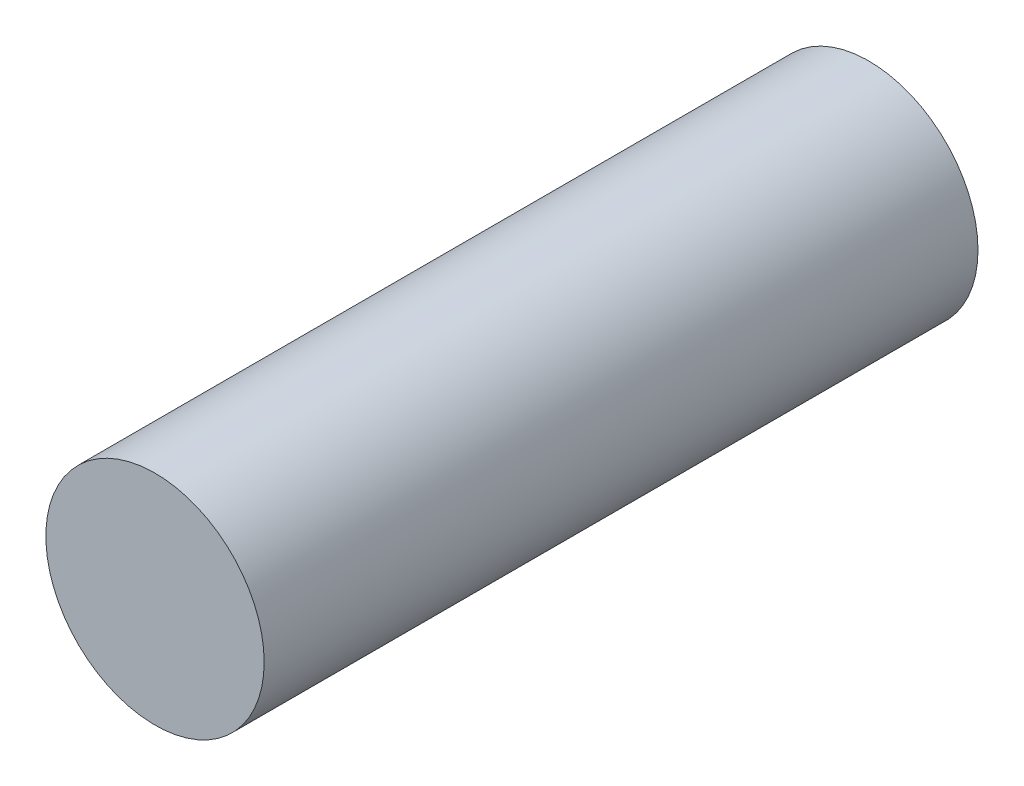
ISO-10303-21;
HEADER;
FILE_DESCRIPTION(('STEP AP214'),'2;1');
FILE_NAME('part.step','',(''),(''),'','','');
FILE_SCHEMA(('AUTOMOTIVE_DESIGN { 1 0 10303 214 1 1 1 1 }'));
ENDSEC;
DATA;
#1=APPLICATION_CONTEXT('core data for automotive mechanical design processes');
#2=APPLICATION_PROTOCOL_DEFINITION('international standard','automotive_design',2000,#1);
#3=PRODUCT_CONTEXT('',#1,'mechanical');
#4=PRODUCT('Part','Part','',(#3));
#5=PRODUCT_RELATED_PRODUCT_CATEGORY('part','',(#4));
#6=PRODUCT_DEFINITION_FORMATION('','',#4);
#7=PRODUCT_DEFINITION_CONTEXT('part definition',#1,'design');
#8=PRODUCT_DEFINITION('design','',#6,#7);
#9=PRODUCT_DEFINITION_SHAPE('','',#8);
#10=(LENGTH_UNIT() NAMED_UNIT(*) SI_UNIT(.MILLI.,.METRE.));
#11=(NAMED_UNIT(*) PLANE_ANGLE_UNIT() SI_UNIT($,.RADIAN.));
#12=(NAMED_UNIT(*) SI_UNIT($,.STERADIAN.) SOLID_ANGLE_UNIT());
#13=UNCERTAINTY_MEASURE_WITH_UNIT(LENGTH_MEASURE(1.E-05),#10,'distance_accuracy_value','');
#14=(GEOMETRIC_REPRESENTATION_CONTEXT(3) GLOBAL_UNCERTAINTY_ASSIGNED_CONTEXT((#13)) GLOBAL_UNIT_ASSIGNED_CONTEXT((#10,
#11,#12)) REPRESENTATION_CONTEXT('',''));
#15=CARTESIAN_POINT('',(0.,0.,0.));
#16=DIRECTION('',(0.,0.,1.));
#17=DIRECTION('',(1.,0.,0.));
#18=AXIS2_PLACEMENT_3D('',#15,#16,#17);
#19=CARTESIAN_POINT('',(0.,0.,20.76196));
#20=DIRECTION('',(0.,0.,-1.));
#21=DIRECTION('',(-1.,0.,0.));
#22=AXIS2_PLACEMENT_3D('',#19,#20,#21);
#23=CYLINDRICAL_SURFACE('',#22,3.175);
#24=CARTESIAN_POINT('',(0.,0.,20.76196));
#25=DIRECTION('',(0.,0.,1.));
#26=DIRECTION('',(1.,0.,0.));
#27=AXIS2_PLACEMENT_3D('',#24,#25,#26);
#28=CIRCLE('',#27,3.175);
#29=CARTESIAN_POINT('',(3.175,0.,20.76196));
#30=VERTEX_POINT('',#29);
#31=EDGE_CURVE('E10',#30,#30,#28,.T.);
#32=ORIENTED_EDGE('',*,*,#31,.F.);
#33=EDGE_LOOP('',(#32));
#34=FACE_BOUND('',#33,.T.);
#35=CARTESIAN_POINT('',(0.,0.,0.));
#36=DIRECTION('',(0.,0.,1.));
#37=DIRECTION('',(1.,0.,0.));
#38=AXIS2_PLACEMENT_3D('',#35,#36,#37);
#39=CIRCLE('',#38,3.175);
#40=CARTESIAN_POINT('',(3.175,0.,0.));
#41=VERTEX_POINT('',#40);
#42=EDGE_CURVE('E35',#41,#41,#39,.T.);
#43=ORIENTED_EDGE('',*,*,#42,.T.);
#44=EDGE_LOOP('',(#43));
#45=FACE_BOUND('',#44,.T.);
#46=ADVANCED_FACE('F32',(#34,#45),#23,.T.);
#47=CARTESIAN_POINT('',(0.,0.,20.76196));
#48=DIRECTION('',(0.,0.,1.));
#49=DIRECTION('',(1.,0.,0.));
#50=AXIS2_PLACEMENT_3D('',#47,#48,#49);
#51=PLANE('',#50);
#52=ORIENTED_EDGE('',*,*,#31,.T.);
#53=EDGE_LOOP('',(#52));
#54=FACE_BOUND('',#53,.T.);
#55=ADVANCED_FACE('F49',(#54),#51,.T.);
#56=CARTESIAN_POINT('',(0.,0.,0.));
#57=DIRECTION('',(0.,0.,1.));
#58=DIRECTION('',(1.,0.,0.));
#59=AXIS2_PLACEMENT_3D('',#56,#57,#58);
#60=PLANE('',#59);
#61=ORIENTED_EDGE('',*,*,#42,.F.);
#62=EDGE_LOOP('',(#61));
#63=FACE_BOUND('',#62,.T.);
#64=ADVANCED_FACE('F47',(#63),#60,.F.);
#65=CLOSED_SHELL('',(#46,#55,#64));
#66=MANIFOLD_SOLID_BREP('B2',#65);
#67=ADVANCED_BREP_SHAPE_REPRESENTATION('',(#18,#66),#14);
#68=SHAPE_DEFINITION_REPRESENTATION(#9,#67);
ENDSEC;
END-ISO-10303-21;
